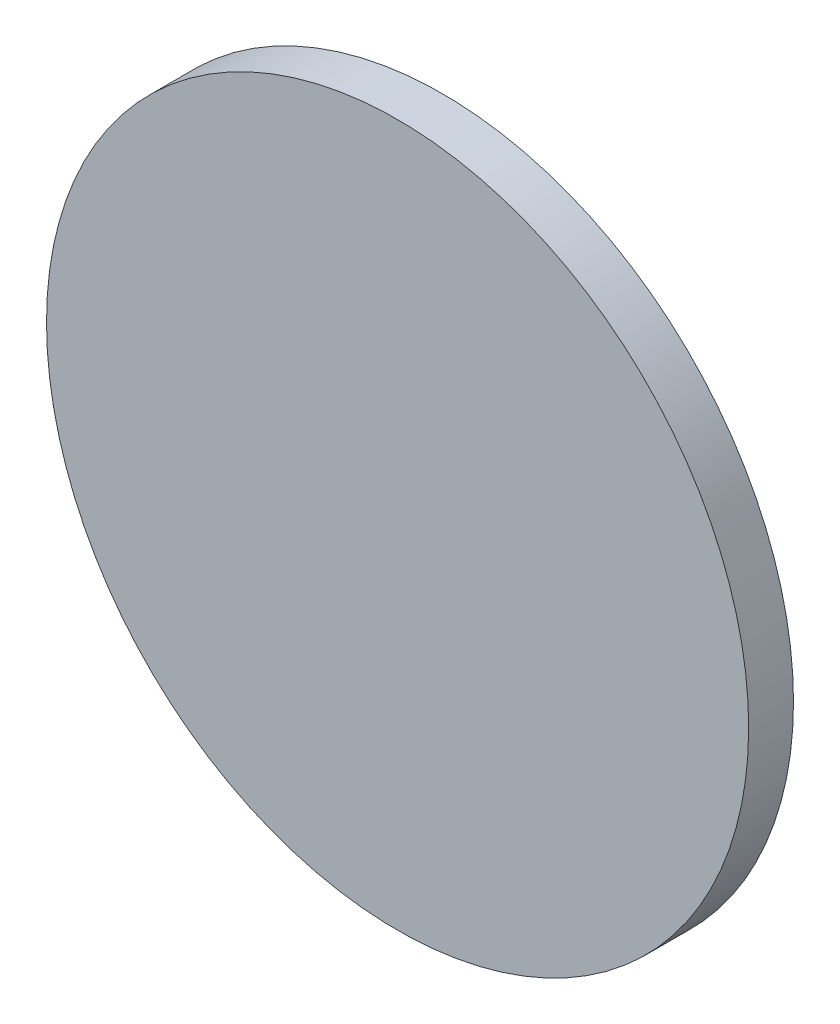
ISO-10303-21;
HEADER;
FILE_DESCRIPTION(('STEP AP214'),'2;1');
FILE_NAME('part.step','',(''),(''),'','','');
FILE_SCHEMA(('AUTOMOTIVE_DESIGN { 1 0 10303 214 1 1 1 1 }'));
ENDSEC;
DATA;
#1=APPLICATION_CONTEXT('core data for automotive mechanical design processes');
#2=APPLICATION_PROTOCOL_DEFINITION('international standard','automotive_design',2000,#1);
#3=PRODUCT_CONTEXT('',#1,'mechanical');
#4=PRODUCT('Part','Part','',(#3));
#5=PRODUCT_RELATED_PRODUCT_CATEGORY('part','',(#4));
#6=PRODUCT_DEFINITION_FORMATION('','',#4);
#7=PRODUCT_DEFINITION_CONTEXT('part definition',#1,'design');
#8=PRODUCT_DEFINITION('design','',#6,#7);
#9=PRODUCT_DEFINITION_SHAPE('','',#8);
#10=(LENGTH_UNIT() NAMED_UNIT(*) SI_UNIT(.MILLI.,.METRE.));
#11=(NAMED_UNIT(*) PLANE_ANGLE_UNIT() SI_UNIT($,.RADIAN.));
#12=(NAMED_UNIT(*) SI_UNIT($,.STERADIAN.) SOLID_ANGLE_UNIT());
#13=UNCERTAINTY_MEASURE_WITH_UNIT(LENGTH_MEASURE(1.E-05),#10,'distance_accuracy_value','');
#14=(GEOMETRIC_REPRESENTATION_CONTEXT(3) GLOBAL_UNCERTAINTY_ASSIGNED_CONTEXT((#13)) GLOBAL_UNIT_ASSIGNED_CONTEXT((#10,
#11,#12)) REPRESENTATION_CONTEXT('',''));
#15=CARTESIAN_POINT('',(0.,0.,0.));
#16=DIRECTION('',(0.,0.,1.));
#17=DIRECTION('',(1.,0.,0.));
#18=AXIS2_PLACEMENT_3D('',#15,#16,#17);
#19=CARTESIAN_POINT('',(0.,0.,15.));
#20=DIRECTION('',(0.,0.,-1.));
#21=DIRECTION('',(-1.,0.,0.));
#22=AXIS2_PLACEMENT_3D('',#19,#20,#21);
#23=CYLINDRICAL_SURFACE('',#22,117.5);
#24=CARTESIAN_POINT('',(0.,0.,15.));
#25=DIRECTION('',(0.,0.,1.));
#26=DIRECTION('',(1.,0.,0.));
#27=AXIS2_PLACEMENT_3D('',#24,#25,#26);
#28=CIRCLE('',#27,117.5);
#29=CARTESIAN_POINT('',(117.5,0.,15.));
#30=VERTEX_POINT('',#29);
#31=EDGE_CURVE('E10',#30,#30,#28,.T.);
#32=ORIENTED_EDGE('',*,*,#31,.F.);
#33=EDGE_LOOP('',(#32));
#34=FACE_BOUND('',#33,.T.);
#35=CARTESIAN_POINT('',(0.,0.,0.));
#36=DIRECTION('',(0.,0.,1.));
#37=DIRECTION('',(1.,0.,0.));
#38=AXIS2_PLACEMENT_3D('',#35,#36,#37);
#39=CIRCLE('',#38,117.5);
#40=CARTESIAN_POINT('',(117.5,0.,0.));
#41=VERTEX_POINT('',#40);
#42=EDGE_CURVE('E35',#41,#41,#39,.T.);
#43=ORIENTED_EDGE('',*,*,#42,.T.);
#44=EDGE_LOOP('',(#43));
#45=FACE_BOUND('',#44,.T.);
#46=ADVANCED_FACE('F32',(#34,#45),#23,.T.);
#47=CARTESIAN_POINT('',(0.,0.,15.));
#48=DIRECTION('',(0.,0.,1.));
#49=DIRECTION('',(1.,0.,0.));
#50=AXIS2_PLACEMENT_3D('',#47,#48,#49);
#51=PLANE('',#50);
#52=ORIENTED_EDGE('',*,*,#31,.T.);
#53=EDGE_LOOP('',(#52));
#54=FACE_BOUND('',#53,.T.);
#55=ADVANCED_FACE('F47',(#54),#51,.T.);
#56=CARTESIAN_POINT('',(0.,0.,0.));
#57=DIRECTION('',(0.,0.,1.));
#58=DIRECTION('',(1.,0.,0.));
#59=AXIS2_PLACEMENT_3D('',#56,#57,#58);
#60=PLANE('',#59);
#61=ORIENTED_EDGE('',*,*,#42,.F.);
#62=EDGE_LOOP('',(#61));
#63=FACE_BOUND('',#62,.T.);
#64=ADVANCED_FACE('F45',(#63),#60,.F.);
#65=CLOSED_SHELL('',(#46,#55,#64));
#66=MANIFOLD_SOLID_BREP('B2',#65);
#67=ADVANCED_BREP_SHAPE_REPRESENTATION('',(#18,#66),#14);
#68=SHAPE_DEFINITION_REPRESENTATION(#9,#67);
ENDSEC;
END-ISO-10303-21;
